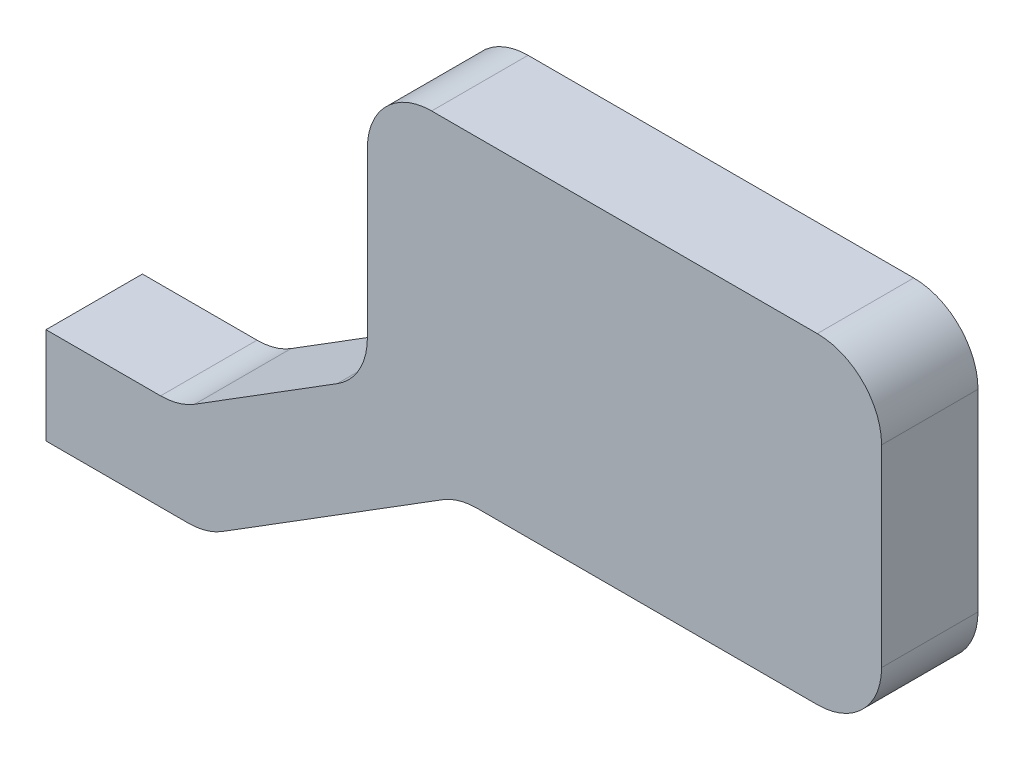
ISO-10303-21;
HEADER;
FILE_DESCRIPTION(('STEP AP214'),'2;1');
FILE_NAME('part.step','',(''),(''),'','','');
FILE_SCHEMA(('AUTOMOTIVE_DESIGN { 1 0 10303 214 1 1 1 1 }'));
ENDSEC;
DATA;
#1=APPLICATION_CONTEXT('core data for automotive mechanical design processes');
#2=APPLICATION_PROTOCOL_DEFINITION('international standard','automotive_design',2000,#1);
#3=PRODUCT_CONTEXT('',#1,'mechanical');
#4=PRODUCT('Part','Part','',(#3));
#5=PRODUCT_RELATED_PRODUCT_CATEGORY('part','',(#4));
#6=PRODUCT_DEFINITION_FORMATION('','',#4);
#7=PRODUCT_DEFINITION_CONTEXT('part definition',#1,'design');
#8=PRODUCT_DEFINITION('design','',#6,#7);
#9=PRODUCT_DEFINITION_SHAPE('','',#8);
#10=(LENGTH_UNIT() NAMED_UNIT(*) SI_UNIT(.MILLI.,.METRE.));
#11=(NAMED_UNIT(*) PLANE_ANGLE_UNIT() SI_UNIT($,.RADIAN.));
#12=(NAMED_UNIT(*) SI_UNIT($,.STERADIAN.) SOLID_ANGLE_UNIT());
#13=UNCERTAINTY_MEASURE_WITH_UNIT(LENGTH_MEASURE(1.E-05),#10,'distance_accuracy_value','');
#14=(GEOMETRIC_REPRESENTATION_CONTEXT(3) GLOBAL_UNCERTAINTY_ASSIGNED_CONTEXT((#13)) GLOBAL_UNIT_ASSIGNED_CONTEXT((#10,
#11,#12)) REPRESENTATION_CONTEXT('',''));
#15=CARTESIAN_POINT('',(0.,0.,0.));
#16=DIRECTION('',(0.,0.,1.));
#17=DIRECTION('',(1.,0.,0.));
#18=AXIS2_PLACEMENT_3D('',#15,#16,#17);
#19=CARTESIAN_POINT('',(0.794998410004769,-1.27199745600763,3.));
#20=DIRECTION('',(-0.52999894000318,0.847998304005088,0.));
#21=DIRECTION('',(-0.847998304005088,-0.52999894000318,0.));
#22=AXIS2_PLACEMENT_3D('',#19,#20,#21);
#23=PLANE('',#22);
#24=DIRECTION('',(0.847998304005088,0.52999894000318,0.));
#25=VECTOR('',#24,1.);
#26=CARTESIAN_POINT('',(0.794998410004769,-1.27199745600763,3.));
#27=LINE('',#26,#25);
#28=CARTESIAN_POINT('',(-12.5135945728163,-9.58986807027079,3.));
#29=VERTEX_POINT('',#28);
#30=CARTESIAN_POINT('',(-5.65621108756674,-5.30400339198982,3.));
#31=VERTEX_POINT('',#30);
#32=EDGE_CURVE('E203',#29,#31,#27,.T.);
#33=ORIENTED_EDGE('',*,*,#32,.F.);
#34=DIRECTION('',(0.,0.,-1.));
#35=VECTOR('',#34,1.);
#36=CARTESIAN_POINT('',(-12.5135945728163,-9.58986807027079,3.));
#37=LINE('',#36,#35);
#38=CARTESIAN_POINT('',(-12.5135945728163,-9.58986807027079,0.));
#39=VERTEX_POINT('',#38);
#40=EDGE_CURVE('E206',#29,#39,#37,.T.);
#41=ORIENTED_EDGE('',*,*,#40,.T.);
#42=DIRECTION('',(0.847998304005088,0.52999894000318,0.));
#43=VECTOR('',#42,1.);
#44=CARTESIAN_POINT('',(0.794998410004769,-1.27199745600763,0.));
#45=LINE('',#44,#43);
#46=CARTESIAN_POINT('',(-5.65621108756674,-5.30400339198982,0.));
#47=VERTEX_POINT('',#46);
#48=EDGE_CURVE('E180',#39,#47,#45,.T.);
#49=ORIENTED_EDGE('',*,*,#48,.T.);
#50=DIRECTION('',(0.,0.,-1.));
#51=VECTOR('',#50,1.);
#52=CARTESIAN_POINT('',(-5.65621108756674,-5.30400339198982,3.));
#53=LINE('',#52,#51);
#54=EDGE_CURVE('E169',#47,#31,#53,.F.);
#55=ORIENTED_EDGE('',*,*,#54,.T.);
#56=EDGE_LOOP('',(#33,#41,#49,#55));
#57=FACE_BOUND('',#56,.T.);
#58=ADVANCED_FACE('F39',(#57),#23,.F.);
#59=CARTESIAN_POINT('',(0.,-5.,3.));
#60=DIRECTION('',(0.,1.,0.));
#61=DIRECTION('',(0.,0.,1.));
#62=AXIS2_PLACEMENT_3D('',#59,#60,#61);
#63=PLANE('',#62);
#64=DIRECTION('',(1.,0.,0.));
#65=VECTOR('',#64,1.);
#66=CARTESIAN_POINT('',(0.,-5.,3.));
#67=LINE('',#66,#65);
#68=CARTESIAN_POINT('',(-4.59621320756038,-5.,3.));
#69=VERTEX_POINT('',#68);
#70=CARTESIAN_POINT('',(6.,-5.,3.));
#71=VERTEX_POINT('',#70);
#72=EDGE_CURVE('E274',#69,#71,#67,.T.);
#73=ORIENTED_EDGE('',*,*,#72,.F.);
#74=DIRECTION('',(0.,0.,-1.));
#75=VECTOR('',#74,1.);
#76=CARTESIAN_POINT('',(-4.59621320756038,-5.,0.));
#77=LINE('',#76,#75);
#78=CARTESIAN_POINT('',(-4.59621320756038,-5.,0.));
#79=VERTEX_POINT('',#78);
#80=EDGE_CURVE('E245',#69,#79,#77,.T.);
#81=ORIENTED_EDGE('',*,*,#80,.T.);
#82=DIRECTION('',(1.,0.,0.));
#83=VECTOR('',#82,1.);
#84=CARTESIAN_POINT('',(0.,-5.,0.));
#85=LINE('',#84,#83);
#86=CARTESIAN_POINT('',(6.,-5.,0.));
#87=VERTEX_POINT('',#86);
#88=EDGE_CURVE('E183',#79,#87,#85,.T.);
#89=ORIENTED_EDGE('',*,*,#88,.T.);
#90=DIRECTION('',(0.,0.,-1.));
#91=VECTOR('',#90,1.);
#92=CARTESIAN_POINT('',(6.,-5.,3.));
#93=LINE('',#92,#91);
#94=EDGE_CURVE('E243',#87,#71,#93,.F.);
#95=ORIENTED_EDGE('',*,*,#94,.T.);
#96=EDGE_LOOP('',(#73,#81,#89,#95));
#97=FACE_BOUND('',#96,.T.);
#98=ADVANCED_FACE('F277',(#97),#63,.F.);
#99=CARTESIAN_POINT('',(8.,0.,3.));
#100=DIRECTION('',(-1.,0.,0.));
#101=DIRECTION('',(0.,0.,1.));
#102=AXIS2_PLACEMENT_3D('',#99,#100,#101);
#103=PLANE('',#102);
#104=DIRECTION('',(0.,1.,0.));
#105=VECTOR('',#104,1.);
#106=CARTESIAN_POINT('',(8.,0.,3.));
#107=LINE('',#106,#105);
#108=CARTESIAN_POINT('',(8.,-3.,3.));
#109=VERTEX_POINT('',#108);
#110=CARTESIAN_POINT('',(8.,3.,3.));
#111=VERTEX_POINT('',#110);
#112=EDGE_CURVE('E279',#109,#111,#107,.T.);
#113=ORIENTED_EDGE('',*,*,#112,.F.);
#114=DIRECTION('',(0.,0.,-1.));
#115=VECTOR('',#114,1.);
#116=CARTESIAN_POINT('',(8.,-3.,3.));
#117=LINE('',#116,#115);
#118=CARTESIAN_POINT('',(8.,-3.,0.));
#119=VERTEX_POINT('',#118);
#120=EDGE_CURVE('E250',#109,#119,#117,.T.);
#121=ORIENTED_EDGE('',*,*,#120,.T.);
#122=DIRECTION('',(0.,1.,0.));
#123=VECTOR('',#122,1.);
#124=CARTESIAN_POINT('',(8.,0.,0.));
#125=LINE('',#124,#123);
#126=CARTESIAN_POINT('',(8.,3.,0.));
#127=VERTEX_POINT('',#126);
#128=EDGE_CURVE('E186',#119,#127,#125,.T.);
#129=ORIENTED_EDGE('',*,*,#128,.T.);
#130=DIRECTION('',(0.,0.,-1.));
#131=VECTOR('',#130,1.);
#132=CARTESIAN_POINT('',(8.,3.,3.));
#133=LINE('',#132,#131);
#134=EDGE_CURVE('E248',#127,#111,#133,.F.);
#135=ORIENTED_EDGE('',*,*,#134,.T.);
#136=EDGE_LOOP('',(#113,#121,#129,#135));
#137=FACE_BOUND('',#136,.T.);
#138=ADVANCED_FACE('F317',(#137),#103,.F.);
#139=CARTESIAN_POINT('',(0.,5.,3.));
#140=DIRECTION('',(0.,1.,0.));
#141=DIRECTION('',(0.,0.,1.));
#142=AXIS2_PLACEMENT_3D('',#139,#140,#141);
#143=PLANE('',#142);
#144=DIRECTION('',(1.,0.,0.));
#145=VECTOR('',#144,1.);
#146=CARTESIAN_POINT('',(0.,5.,0.));
#147=LINE('',#146,#145);
#148=CARTESIAN_POINT('',(-6.,5.,0.));
#149=VERTEX_POINT('',#148);
#150=CARTESIAN_POINT('',(6.,5.,0.));
#151=VERTEX_POINT('',#150);
#152=EDGE_CURVE('E189',#149,#151,#147,.T.);
#153=ORIENTED_EDGE('',*,*,#152,.F.);
#154=DIRECTION('',(0.,0.,-1.));
#155=VECTOR('',#154,1.);
#156=CARTESIAN_POINT('',(-6.,5.,3.));
#157=LINE('',#156,#155);
#158=CARTESIAN_POINT('',(-6.,5.,3.));
#159=VERTEX_POINT('',#158);
#160=EDGE_CURVE('E241',#149,#159,#157,.F.);
#161=ORIENTED_EDGE('',*,*,#160,.T.);
#162=DIRECTION('',(1.,0.,0.));
#163=VECTOR('',#162,1.);
#164=CARTESIAN_POINT('',(0.,5.,3.));
#165=LINE('',#164,#163);
#166=CARTESIAN_POINT('',(6.,5.,3.));
#167=VERTEX_POINT('',#166);
#168=EDGE_CURVE('E282',#159,#167,#165,.T.);
#169=ORIENTED_EDGE('',*,*,#168,.T.);
#170=DIRECTION('',(0.,0.,-1.));
#171=VECTOR('',#170,1.);
#172=CARTESIAN_POINT('',(6.,5.,0.));
#173=LINE('',#172,#171);
#174=EDGE_CURVE('E238',#167,#151,#173,.T.);
#175=ORIENTED_EDGE('',*,*,#174,.T.);
#176=EDGE_LOOP('',(#153,#161,#169,#175));
#177=FACE_BOUND('',#176,.T.);
#178=ADVANCED_FACE('F322',(#177),#143,.T.);
#179=CARTESIAN_POINT('',(-8.,0.,3.));
#180=DIRECTION('',(-1.,0.,0.));
#181=DIRECTION('',(0.,0.,1.));
#182=AXIS2_PLACEMENT_3D('',#179,#180,#181);
#183=PLANE('',#182);
#184=DIRECTION('',(0.,1.,0.));
#185=VECTOR('',#184,1.);
#186=CARTESIAN_POINT('',(-8.,0.,0.));
#187=LINE('',#186,#185);
#188=CARTESIAN_POINT('',(-8.,-2.12263325472523,0.));
#189=VERTEX_POINT('',#188);
#190=CARTESIAN_POINT('',(-8.,3.,0.));
#191=VERTEX_POINT('',#190);
#192=EDGE_CURVE('E192',#189,#191,#187,.T.);
#193=ORIENTED_EDGE('',*,*,#192,.F.);
#194=DIRECTION('',(0.,0.,-1.));
#195=VECTOR('',#194,1.);
#196=CARTESIAN_POINT('',(-8.,-2.12263325472523,3.));
#197=LINE('',#196,#195);
#198=CARTESIAN_POINT('',(-8.,-2.12263325472523,3.));
#199=VERTEX_POINT('',#198);
#200=EDGE_CURVE('E236',#189,#199,#197,.F.);
#201=ORIENTED_EDGE('',*,*,#200,.T.);
#202=DIRECTION('',(0.,1.,0.));
#203=VECTOR('',#202,1.);
#204=CARTESIAN_POINT('',(-8.,0.,3.));
#205=LINE('',#204,#203);
#206=CARTESIAN_POINT('',(-8.,3.,3.));
#207=VERTEX_POINT('',#206);
#208=EDGE_CURVE('E288',#199,#207,#205,.T.);
#209=ORIENTED_EDGE('',*,*,#208,.T.);
#210=DIRECTION('',(0.,0.,-1.));
#211=VECTOR('',#210,1.);
#212=CARTESIAN_POINT('',(-8.,3.,3.));
#213=LINE('',#212,#211);
#214=EDGE_CURVE('E233',#207,#191,#213,.T.);
#215=ORIENTED_EDGE('',*,*,#214,.T.);
#216=EDGE_LOOP('',(#193,#201,#209,#215));
#217=FACE_BOUND('',#216,.T.);
#218=ADVANCED_FACE('F326',(#217),#183,.T.);
#219=CARTESIAN_POINT('',(-0.794998410004772,1.27199745600763,3.));
#220=DIRECTION('',(0.52999894000318,-0.847998304005088,0.));
#221=DIRECTION('',(0.847998304005088,0.52999894000318,0.));
#222=AXIS2_PLACEMENT_3D('',#219,#220,#221);
#223=PLANE('',#222);
#224=DIRECTION('',(-0.847998304005088,-0.52999894000318,0.));
#225=VECTOR('',#224,1.);
#226=CARTESIAN_POINT('',(-0.794998410004772,1.27199745600763,0.));
#227=LINE('',#226,#225);
#228=CARTESIAN_POINT('',(-8.94000211999364,-3.81862986273541,0.));
#229=VERTEX_POINT('',#228);
#230=CARTESIAN_POINT('',(-13.3739832520502,-6.58986807027079,0.));
#231=VERTEX_POINT('',#230);
#232=EDGE_CURVE('E195',#229,#231,#227,.T.);
#233=ORIENTED_EDGE('',*,*,#232,.T.);
#234=DIRECTION('',(0.,0.,-1.));
#235=VECTOR('',#234,1.);
#236=CARTESIAN_POINT('',(-13.3739832520502,-6.58986807027079,3.));
#237=LINE('',#236,#235);
#238=CARTESIAN_POINT('',(-13.3739832520502,-6.58986807027079,3.));
#239=VERTEX_POINT('',#238);
#240=EDGE_CURVE('E62',#231,#239,#237,.F.);
#241=ORIENTED_EDGE('',*,*,#240,.T.);
#242=DIRECTION('',(-0.847998304005088,-0.52999894000318,0.));
#243=VECTOR('',#242,1.);
#244=CARTESIAN_POINT('',(-0.794998410004772,1.27199745600763,3.));
#245=LINE('',#244,#243);
#246=CARTESIAN_POINT('',(-8.94000211999364,-3.81862986273541,3.));
#247=VERTEX_POINT('',#246);
#248=EDGE_CURVE('E160',#247,#239,#245,.T.);
#249=ORIENTED_EDGE('',*,*,#248,.F.);
#250=DIRECTION('',(0.,0.,-1.));
#251=VECTOR('',#250,1.);
#252=CARTESIAN_POINT('',(-8.94000211999364,-3.81862986273541,3.));
#253=LINE('',#252,#251);
#254=EDGE_CURVE('E229',#247,#229,#253,.T.);
#255=ORIENTED_EDGE('',*,*,#254,.T.);
#256=EDGE_LOOP('',(#233,#241,#249,#255));
#257=FACE_BOUND('',#256,.T.);
#258=ADVANCED_FACE('F330',(#257),#223,.F.);
#259=CARTESIAN_POINT('',(0.,-6.89387146226061,3.));
#260=DIRECTION('',(0.,-1.,0.));
#261=DIRECTION('',(1.,0.,0.));
#262=AXIS2_PLACEMENT_3D('',#259,#260,#261);
#263=PLANE('',#262);
#264=DIRECTION('',(-1.,0.,0.));
#265=VECTOR('',#264,1.);
#266=CARTESIAN_POINT('',(0.,-6.89387146226061,3.));
#267=LINE('',#266,#265);
#268=CARTESIAN_POINT('',(-14.4339811320566,-6.89387146226061,3.));
#269=VERTEX_POINT('',#268);
#270=CARTESIAN_POINT('',(-18.,-6.89387146226061,3.));
#271=VERTEX_POINT('',#270);
#272=EDGE_CURVE('E150',#269,#271,#267,.T.);
#273=ORIENTED_EDGE('',*,*,#272,.F.);
#274=DIRECTION('',(0.,0.,-1.));
#275=VECTOR('',#274,1.);
#276=CARTESIAN_POINT('',(-14.4339811320566,-6.89387146226061,0.));
#277=LINE('',#276,#275);
#278=CARTESIAN_POINT('',(-14.4339811320566,-6.89387146226061,0.));
#279=VERTEX_POINT('',#278);
#280=EDGE_CURVE('E227',#269,#279,#277,.T.);
#281=ORIENTED_EDGE('',*,*,#280,.T.);
#282=DIRECTION('',(-1.,0.,0.));
#283=VECTOR('',#282,1.);
#284=CARTESIAN_POINT('',(0.,-6.89387146226061,0.));
#285=LINE('',#284,#283);
#286=CARTESIAN_POINT('',(-18.,-6.89387146226061,0.));
#287=VERTEX_POINT('',#286);
#288=EDGE_CURVE('E166',#279,#287,#285,.T.);
#289=ORIENTED_EDGE('',*,*,#288,.T.);
#290=DIRECTION('',(0.,0.,-1.));
#291=VECTOR('',#290,1.);
#292=CARTESIAN_POINT('',(-18.,-6.89387146226061,3.));
#293=LINE('',#292,#291);
#294=EDGE_CURVE('E163',#271,#287,#293,.T.);
#295=ORIENTED_EDGE('',*,*,#294,.F.);
#296=EDGE_LOOP('',(#273,#281,#289,#295));
#297=FACE_BOUND('',#296,.T.);
#298=ADVANCED_FACE('F164',(#297),#263,.F.);
#299=CARTESIAN_POINT('',(-18.,0.,3.));
#300=DIRECTION('',(1.,0.,0.));
#301=DIRECTION('',(0.,1.,0.));
#302=AXIS2_PLACEMENT_3D('',#299,#300,#301);
#303=PLANE('',#302);
#304=DIRECTION('',(0.,-1.,0.));
#305=VECTOR('',#304,1.);
#306=CARTESIAN_POINT('',(-18.,0.,0.));
#307=LINE('',#306,#305);
#308=CARTESIAN_POINT('',(-18.,-9.89387146226061,0.));
#309=VERTEX_POINT('',#308);
#310=EDGE_CURVE('E198',#287,#309,#307,.T.);
#311=ORIENTED_EDGE('',*,*,#310,.T.);
#312=DIRECTION('',(0.,0.,-1.));
#313=VECTOR('',#312,1.);
#314=CARTESIAN_POINT('',(-18.,-9.89387146226061,3.));
#315=LINE('',#314,#313);
#316=CARTESIAN_POINT('',(-18.,-9.89387146226061,3.));
#317=VERTEX_POINT('',#316);
#318=EDGE_CURVE('E170',#317,#309,#315,.T.);
#319=ORIENTED_EDGE('',*,*,#318,.F.);
#320=DIRECTION('',(0.,-1.,0.));
#321=VECTOR('',#320,1.);
#322=CARTESIAN_POINT('',(-18.,0.,3.));
#323=LINE('',#322,#321);
#324=EDGE_CURVE('E155',#271,#317,#323,.T.);
#325=ORIENTED_EDGE('',*,*,#324,.F.);
#326=ORIENTED_EDGE('',*,*,#294,.T.);
#327=EDGE_LOOP('',(#311,#319,#325,#326));
#328=FACE_BOUND('',#327,.T.);
#329=ADVANCED_FACE('F172',(#328),#303,.F.);
#330=CARTESIAN_POINT('',(0.,-9.89387146226061,3.));
#331=DIRECTION('',(0.,1.,0.));
#332=DIRECTION('',(0.,0.,1.));
#333=AXIS2_PLACEMENT_3D('',#330,#331,#332);
#334=PLANE('',#333);
#335=DIRECTION('',(1.,0.,0.));
#336=VECTOR('',#335,1.);
#337=CARTESIAN_POINT('',(0.,-9.89387146226061,0.));
#338=LINE('',#337,#336);
#339=CARTESIAN_POINT('',(-13.5735924528226,-9.89387146226061,0.));
#340=VERTEX_POINT('',#339);
#341=EDGE_CURVE('E200',#309,#340,#338,.T.);
#342=ORIENTED_EDGE('',*,*,#341,.T.);
#343=DIRECTION('',(0.,0.,-1.));
#344=VECTOR('',#343,1.);
#345=CARTESIAN_POINT('',(-13.5735924528226,-9.89387146226061,3.));
#346=LINE('',#345,#344);
#347=CARTESIAN_POINT('',(-13.5735924528226,-9.89387146226061,3.));
#348=VERTEX_POINT('',#347);
#349=EDGE_CURVE('E217',#340,#348,#346,.F.);
#350=ORIENTED_EDGE('',*,*,#349,.T.);
#351=DIRECTION('',(1.,0.,0.));
#352=VECTOR('',#351,1.);
#353=CARTESIAN_POINT('',(0.,-9.89387146226061,3.));
#354=LINE('',#353,#352);
#355=EDGE_CURVE('E175',#317,#348,#354,.T.);
#356=ORIENTED_EDGE('',*,*,#355,.F.);
#357=ORIENTED_EDGE('',*,*,#318,.T.);
#358=EDGE_LOOP('',(#342,#350,#356,#357));
#359=FACE_BOUND('',#358,.T.);
#360=ADVANCED_FACE('F298',(#359),#334,.F.);
#361=CARTESIAN_POINT('',(0.,0.,3.));
#362=DIRECTION('',(0.,0.,1.));
#363=DIRECTION('',(1.,0.,0.));
#364=AXIS2_PLACEMENT_3D('',#361,#362,#363);
#365=PLANE('',#364);
#366=ORIENTED_EDGE('',*,*,#355,.T.);
#367=CARTESIAN_POINT('',(-13.5735924528226,-7.89387146226061,3.));
#368=DIRECTION('',(0.,0.,1.));
#369=DIRECTION('',(1.,0.,0.));
#370=AXIS2_PLACEMENT_3D('',#367,#368,#369);
#371=CIRCLE('',#370,2.);
#372=EDGE_CURVE('E225',#348,#29,#371,.T.);
#373=ORIENTED_EDGE('',*,*,#372,.T.);
#374=ORIENTED_EDGE('',*,*,#32,.T.);
#375=CARTESIAN_POINT('',(-4.59621320756038,-7.,3.));
#376=DIRECTION('',(0.,0.,1.));
#377=DIRECTION('',(1.,0.,0.));
#378=AXIS2_PLACEMENT_3D('',#375,#376,#377);
#379=CIRCLE('',#378,2.);
#380=EDGE_CURVE('E11',#31,#69,#379,.F.);
#381=ORIENTED_EDGE('',*,*,#380,.T.);
#382=ORIENTED_EDGE('',*,*,#72,.T.);
#383=CARTESIAN_POINT('',(6.,-3.,3.));
#384=DIRECTION('',(0.,0.,1.));
#385=DIRECTION('',(1.,0.,0.));
#386=AXIS2_PLACEMENT_3D('',#383,#384,#385);
#387=CIRCLE('',#386,2.);
#388=EDGE_CURVE('E221',#71,#109,#387,.T.);
#389=ORIENTED_EDGE('',*,*,#388,.T.);
#390=ORIENTED_EDGE('',*,*,#112,.T.);
#391=CARTESIAN_POINT('',(6.,3.,3.));
#392=DIRECTION('',(0.,0.,1.));
#393=DIRECTION('',(1.,0.,0.));
#394=AXIS2_PLACEMENT_3D('',#391,#392,#393);
#395=CIRCLE('',#394,2.);
#396=EDGE_CURVE('E219',#111,#167,#395,.T.);
#397=ORIENTED_EDGE('',*,*,#396,.T.);
#398=ORIENTED_EDGE('',*,*,#168,.F.);
#399=CARTESIAN_POINT('',(-6.,3.,3.));
#400=DIRECTION('',(0.,0.,1.));
#401=DIRECTION('',(1.,0.,0.));
#402=AXIS2_PLACEMENT_3D('',#399,#400,#401);
#403=CIRCLE('',#402,2.);
#404=EDGE_CURVE('E223',#159,#207,#403,.T.);
#405=ORIENTED_EDGE('',*,*,#404,.T.);
#406=ORIENTED_EDGE('',*,*,#208,.F.);
#407=CARTESIAN_POINT('',(-10.,-2.12263325472523,3.));
#408=DIRECTION('',(0.,0.,1.));
#409=DIRECTION('',(1.,0.,0.));
#410=AXIS2_PLACEMENT_3D('',#407,#408,#409);
#411=CIRCLE('',#410,2.);
#412=EDGE_CURVE('E258',#199,#247,#411,.F.);
#413=ORIENTED_EDGE('',*,*,#412,.T.);
#414=ORIENTED_EDGE('',*,*,#248,.T.);
#415=CARTESIAN_POINT('',(-14.4339811320566,-4.89387146226061,3.));
#416=DIRECTION('',(0.,0.,1.));
#417=DIRECTION('',(1.,0.,0.));
#418=AXIS2_PLACEMENT_3D('',#415,#416,#417);
#419=CIRCLE('',#418,2.);
#420=EDGE_CURVE('E54',#239,#269,#419,.F.);
#421=ORIENTED_EDGE('',*,*,#420,.T.);
#422=ORIENTED_EDGE('',*,*,#272,.T.);
#423=ORIENTED_EDGE('',*,*,#324,.T.);
#424=EDGE_LOOP('',(#366,#373,#374,#381,#382,#389,#390,#397,#398,#405,#406,#413,#414,#421,#422,#423));
#425=FACE_BOUND('',#424,.T.);
#426=ADVANCED_FACE('F153',(#425),#365,.T.);
#427=CARTESIAN_POINT('',(0.,0.,0.));
#428=DIRECTION('',(0.,0.,1.));
#429=DIRECTION('',(1.,0.,0.));
#430=AXIS2_PLACEMENT_3D('',#427,#428,#429);
#431=PLANE('',#430);
#432=ORIENTED_EDGE('',*,*,#48,.F.);
#433=CARTESIAN_POINT('',(-13.5735924528226,-7.89387146226061,0.));
#434=DIRECTION('',(0.,0.,1.));
#435=DIRECTION('',(1.,0.,0.));
#436=AXIS2_PLACEMENT_3D('',#433,#434,#435);
#437=CIRCLE('',#436,2.);
#438=EDGE_CURVE('E215',#39,#340,#437,.F.);
#439=ORIENTED_EDGE('',*,*,#438,.T.);
#440=ORIENTED_EDGE('',*,*,#341,.F.);
#441=ORIENTED_EDGE('',*,*,#310,.F.);
#442=ORIENTED_EDGE('',*,*,#288,.F.);
#443=CARTESIAN_POINT('',(-14.4339811320566,-4.89387146226061,0.));
#444=DIRECTION('',(0.,0.,1.));
#445=DIRECTION('',(1.,0.,0.));
#446=AXIS2_PLACEMENT_3D('',#443,#444,#445);
#447=CIRCLE('',#446,2.);
#448=EDGE_CURVE('E253',#279,#231,#447,.T.);
#449=ORIENTED_EDGE('',*,*,#448,.T.);
#450=ORIENTED_EDGE('',*,*,#232,.F.);
#451=CARTESIAN_POINT('',(-10.,-2.12263325472523,0.));
#452=DIRECTION('',(0.,0.,1.));
#453=DIRECTION('',(1.,0.,0.));
#454=AXIS2_PLACEMENT_3D('',#451,#452,#453);
#455=CIRCLE('',#454,2.);
#456=EDGE_CURVE('E256',#229,#189,#455,.T.);
#457=ORIENTED_EDGE('',*,*,#456,.T.);
#458=ORIENTED_EDGE('',*,*,#192,.T.);
#459=CARTESIAN_POINT('',(-6.,3.,0.));
#460=DIRECTION('',(0.,0.,1.));
#461=DIRECTION('',(1.,0.,0.));
#462=AXIS2_PLACEMENT_3D('',#459,#460,#461);
#463=CIRCLE('',#462,2.);
#464=EDGE_CURVE('E213',#191,#149,#463,.F.);
#465=ORIENTED_EDGE('',*,*,#464,.T.);
#466=ORIENTED_EDGE('',*,*,#152,.T.);
#467=CARTESIAN_POINT('',(6.,3.,0.));
#468=DIRECTION('',(0.,0.,1.));
#469=DIRECTION('',(1.,0.,0.));
#470=AXIS2_PLACEMENT_3D('',#467,#468,#469);
#471=CIRCLE('',#470,2.);
#472=EDGE_CURVE('E209',#151,#127,#471,.F.);
#473=ORIENTED_EDGE('',*,*,#472,.T.);
#474=ORIENTED_EDGE('',*,*,#128,.F.);
#475=CARTESIAN_POINT('',(6.,-3.,0.));
#476=DIRECTION('',(0.,0.,1.));
#477=DIRECTION('',(1.,0.,0.));
#478=AXIS2_PLACEMENT_3D('',#475,#476,#477);
#479=CIRCLE('',#478,2.);
#480=EDGE_CURVE('E211',#119,#87,#479,.F.);
#481=ORIENTED_EDGE('',*,*,#480,.T.);
#482=ORIENTED_EDGE('',*,*,#88,.F.);
#483=CARTESIAN_POINT('',(-4.59621320756038,-7.,0.));
#484=DIRECTION('',(0.,0.,1.));
#485=DIRECTION('',(1.,0.,0.));
#486=AXIS2_PLACEMENT_3D('',#483,#484,#485);
#487=CIRCLE('',#486,2.);
#488=EDGE_CURVE('E47',#79,#47,#487,.T.);
#489=ORIENTED_EDGE('',*,*,#488,.T.);
#490=EDGE_LOOP('',(#432,#439,#440,#441,#442,#449,#450,#457,#458,#465,#466,#473,#474,#481,#482,#489));
#491=FACE_BOUND('',#490,.T.);
#492=ADVANCED_FACE('F262',(#491),#431,.F.);
#493=CARTESIAN_POINT('',(-13.5735924528226,-7.89387146226061,3.));
#494=DIRECTION('',(0.,0.,-1.));
#495=DIRECTION('',(-1.,0.,0.));
#496=AXIS2_PLACEMENT_3D('',#493,#494,#495);
#497=CYLINDRICAL_SURFACE('',#496,2.);
#498=ORIENTED_EDGE('',*,*,#372,.F.);
#499=ORIENTED_EDGE('',*,*,#349,.F.);
#500=ORIENTED_EDGE('',*,*,#438,.F.);
#501=ORIENTED_EDGE('',*,*,#40,.F.);
#502=EDGE_LOOP('',(#498,#499,#500,#501));
#503=FACE_BOUND('',#502,.T.);
#504=ADVANCED_FACE('F302',(#503),#497,.T.);
#505=CARTESIAN_POINT('',(-14.4339811320566,-4.89387146226061,3.));
#506=DIRECTION('',(0.,0.,1.));
#507=DIRECTION('',(1.,0.,0.));
#508=AXIS2_PLACEMENT_3D('',#505,#506,#507);
#509=CYLINDRICAL_SURFACE('',#508,2.);
#510=ORIENTED_EDGE('',*,*,#420,.F.);
#511=ORIENTED_EDGE('',*,*,#240,.F.);
#512=ORIENTED_EDGE('',*,*,#448,.F.);
#513=ORIENTED_EDGE('',*,*,#280,.F.);
#514=EDGE_LOOP('',(#510,#511,#512,#513));
#515=FACE_BOUND('',#514,.T.);
#516=ADVANCED_FACE('F294',(#515),#509,.F.);
#517=CARTESIAN_POINT('',(-10.,-2.12263325472523,3.));
#518=DIRECTION('',(0.,0.,-1.));
#519=DIRECTION('',(-1.,0.,0.));
#520=AXIS2_PLACEMENT_3D('',#517,#518,#519);
#521=CYLINDRICAL_SURFACE('',#520,2.);
#522=ORIENTED_EDGE('',*,*,#412,.F.);
#523=ORIENTED_EDGE('',*,*,#200,.F.);
#524=ORIENTED_EDGE('',*,*,#456,.F.);
#525=ORIENTED_EDGE('',*,*,#254,.F.);
#526=EDGE_LOOP('',(#522,#523,#524,#525));
#527=FACE_BOUND('',#526,.T.);
#528=ADVANCED_FACE('F309',(#527),#521,.F.);
#529=CARTESIAN_POINT('',(-6.,3.,3.));
#530=DIRECTION('',(0.,0.,-1.));
#531=DIRECTION('',(-1.,0.,0.));
#532=AXIS2_PLACEMENT_3D('',#529,#530,#531);
#533=CYLINDRICAL_SURFACE('',#532,2.);
#534=ORIENTED_EDGE('',*,*,#404,.F.);
#535=ORIENTED_EDGE('',*,*,#160,.F.);
#536=ORIENTED_EDGE('',*,*,#464,.F.);
#537=ORIENTED_EDGE('',*,*,#214,.F.);
#538=EDGE_LOOP('',(#534,#535,#536,#537));
#539=FACE_BOUND('',#538,.T.);
#540=ADVANCED_FACE('F369',(#539),#533,.T.);
#541=CARTESIAN_POINT('',(-4.59621320756038,-7.,3.));
#542=DIRECTION('',(0.,0.,1.));
#543=DIRECTION('',(1.,0.,0.));
#544=AXIS2_PLACEMENT_3D('',#541,#542,#543);
#545=CYLINDRICAL_SURFACE('',#544,2.);
#546=ORIENTED_EDGE('',*,*,#380,.F.);
#547=ORIENTED_EDGE('',*,*,#54,.F.);
#548=ORIENTED_EDGE('',*,*,#488,.F.);
#549=ORIENTED_EDGE('',*,*,#80,.F.);
#550=EDGE_LOOP('',(#546,#547,#548,#549));
#551=FACE_BOUND('',#550,.T.);
#552=ADVANCED_FACE('F271',(#551),#545,.F.);
#553=CARTESIAN_POINT('',(6.,-3.,3.));
#554=DIRECTION('',(0.,0.,-1.));
#555=DIRECTION('',(-1.,0.,0.));
#556=AXIS2_PLACEMENT_3D('',#553,#554,#555);
#557=CYLINDRICAL_SURFACE('',#556,2.);
#558=ORIENTED_EDGE('',*,*,#388,.F.);
#559=ORIENTED_EDGE('',*,*,#94,.F.);
#560=ORIENTED_EDGE('',*,*,#480,.F.);
#561=ORIENTED_EDGE('',*,*,#120,.F.);
#562=EDGE_LOOP('',(#558,#559,#560,#561));
#563=FACE_BOUND('',#562,.T.);
#564=ADVANCED_FACE('F388',(#563),#557,.T.);
#565=CARTESIAN_POINT('',(6.,3.,3.));
#566=DIRECTION('',(0.,0.,1.));
#567=DIRECTION('',(1.,0.,0.));
#568=AXIS2_PLACEMENT_3D('',#565,#566,#567);
#569=CYLINDRICAL_SURFACE('',#568,2.);
#570=ORIENTED_EDGE('',*,*,#396,.F.);
#571=ORIENTED_EDGE('',*,*,#134,.F.);
#572=ORIENTED_EDGE('',*,*,#472,.F.);
#573=ORIENTED_EDGE('',*,*,#174,.F.);
#574=EDGE_LOOP('',(#570,#571,#572,#573));
#575=FACE_BOUND('',#574,.T.);
#576=ADVANCED_FACE('F41',(#575),#569,.T.);
#577=CLOSED_SHELL('',(#58,#98,#138,#178,#218,#258,#298,#329,#360,#426,#492,#504,#516,#528,#540,
#552,#564,#576));
#578=MANIFOLD_SOLID_BREP('B2',#577);
#579=ADVANCED_BREP_SHAPE_REPRESENTATION('',(#18,#578),#14);
#580=SHAPE_DEFINITION_REPRESENTATION(#9,#579);
ENDSEC;
END-ISO-10303-21;
